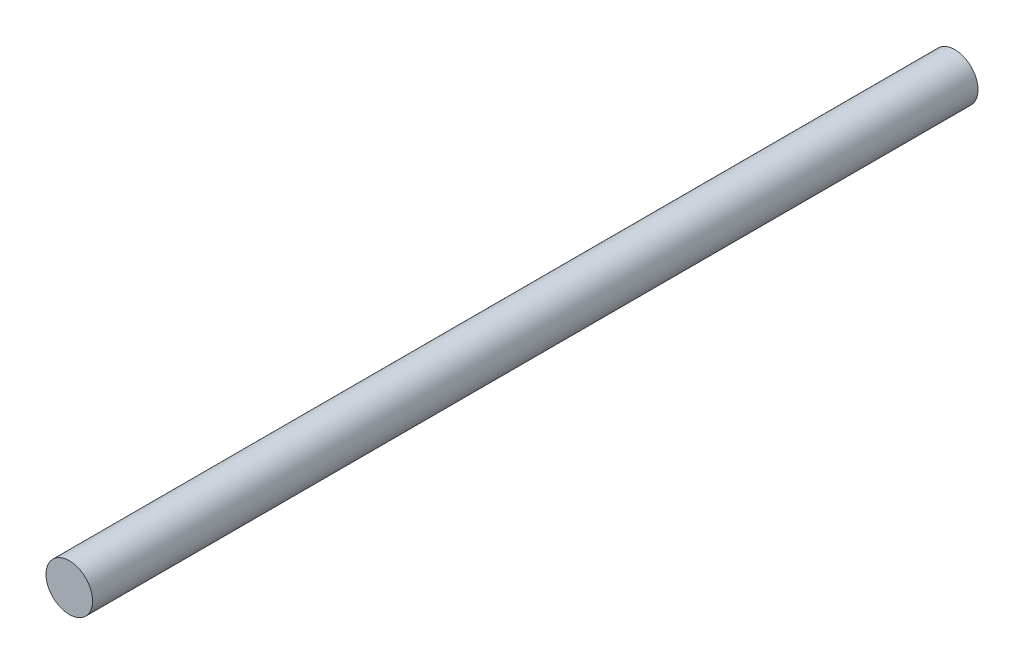
ISO-10303-21;
HEADER;
FILE_DESCRIPTION(('STEP AP214'),'2;1');
FILE_NAME('part.step','',(''),(''),'','','');
FILE_SCHEMA(('AUTOMOTIVE_DESIGN { 1 0 10303 214 1 1 1 1 }'));
ENDSEC;
DATA;
#1=APPLICATION_CONTEXT('core data for automotive mechanical design processes');
#2=APPLICATION_PROTOCOL_DEFINITION('international standard','automotive_design',2000,#1);
#3=PRODUCT_CONTEXT('',#1,'mechanical');
#4=PRODUCT('Part','Part','',(#3));
#5=PRODUCT_RELATED_PRODUCT_CATEGORY('part','',(#4));
#6=PRODUCT_DEFINITION_FORMATION('','',#4);
#7=PRODUCT_DEFINITION_CONTEXT('part definition',#1,'design');
#8=PRODUCT_DEFINITION('design','',#6,#7);
#9=PRODUCT_DEFINITION_SHAPE('','',#8);
#10=(LENGTH_UNIT() NAMED_UNIT(*) SI_UNIT(.MILLI.,.METRE.));
#11=(NAMED_UNIT(*) PLANE_ANGLE_UNIT() SI_UNIT($,.RADIAN.));
#12=(NAMED_UNIT(*) SI_UNIT($,.STERADIAN.) SOLID_ANGLE_UNIT());
#13=UNCERTAINTY_MEASURE_WITH_UNIT(LENGTH_MEASURE(1.E-05),#10,'distance_accuracy_value','');
#14=(GEOMETRIC_REPRESENTATION_CONTEXT(3) GLOBAL_UNCERTAINTY_ASSIGNED_CONTEXT((#13)) GLOBAL_UNIT_ASSIGNED_CONTEXT((#10,
#11,#12)) REPRESENTATION_CONTEXT('',''));
#15=CARTESIAN_POINT('',(0.,0.,0.));
#16=DIRECTION('',(0.,0.,1.));
#17=DIRECTION('',(1.,0.,0.));
#18=AXIS2_PLACEMENT_3D('',#15,#16,#17);
#19=CARTESIAN_POINT('',(0.,0.,241.3));
#20=DIRECTION('',(0.,0.,-1.));
#21=DIRECTION('',(-1.,0.,0.));
#22=AXIS2_PLACEMENT_3D('',#19,#20,#21);
#23=CYLINDRICAL_SURFACE('',#22,6.35);
#24=CARTESIAN_POINT('',(0.,0.,241.3));
#25=DIRECTION('',(0.,0.,1.));
#26=DIRECTION('',(1.,0.,0.));
#27=AXIS2_PLACEMENT_3D('',#24,#25,#26);
#28=CIRCLE('',#27,6.35);
#29=CARTESIAN_POINT('',(-6.35,0.,241.3));
#30=VERTEX_POINT('',#29);
#31=EDGE_CURVE('E10',#30,#30,#28,.T.);
#32=CARTESIAN_POINT('',(0.,0.,0.));
#33=DIRECTION('',(0.,0.,1.));
#34=DIRECTION('',(1.,0.,0.));
#35=AXIS2_PLACEMENT_3D('',#32,#33,#34);
#36=CIRCLE('',#35,6.35);
#37=CARTESIAN_POINT('',(-6.35,0.,0.));
#38=VERTEX_POINT('',#37);
#39=EDGE_CURVE('E38',#38,#38,#36,.T.);
#40=CARTESIAN_POINT('',(-6.35,0.,241.3));
#41=CARTESIAN_POINT('',(-6.35,0.,238.786458333333));
#42=CARTESIAN_POINT('',(-6.35,0.,236.272916666667));
#43=CARTESIAN_POINT('',(-6.35,0.,231.245833333333));
#44=CARTESIAN_POINT('',(-6.35,0.,228.732291666667));
#45=CARTESIAN_POINT('',(-6.35,0.,223.705208333333));
#46=CARTESIAN_POINT('',(-6.35,0.,221.191666666667));
#47=CARTESIAN_POINT('',(-6.35,0.,216.164583333333));
#48=CARTESIAN_POINT('',(-6.35,0.,213.651041666667));
#49=CARTESIAN_POINT('',(-6.35,0.,208.623958333333));
#50=CARTESIAN_POINT('',(-6.35,0.,206.110416666667));
#51=CARTESIAN_POINT('',(-6.35,0.,201.083333333333));
#52=CARTESIAN_POINT('',(-6.35,0.,198.569791666667));
#53=CARTESIAN_POINT('',(-6.35,0.,193.542708333333));
#54=CARTESIAN_POINT('',(-6.35,0.,191.029166666667));
#55=CARTESIAN_POINT('',(-6.35,0.,186.002083333333));
#56=CARTESIAN_POINT('',(-6.35,0.,183.488541666667));
#57=CARTESIAN_POINT('',(-6.35,0.,178.461458333333));
#58=CARTESIAN_POINT('',(-6.35,0.,175.947916666667));
#59=CARTESIAN_POINT('',(-6.35,0.,170.920833333333));
#60=CARTESIAN_POINT('',(-6.35,0.,168.407291666667));
#61=CARTESIAN_POINT('',(-6.35,0.,163.380208333333));
#62=CARTESIAN_POINT('',(-6.35,0.,160.866666666667));
#63=CARTESIAN_POINT('',(-6.35,0.,155.839583333333));
#64=CARTESIAN_POINT('',(-6.35,0.,153.326041666667));
#65=CARTESIAN_POINT('',(-6.35,0.,148.298958333333));
#66=CARTESIAN_POINT('',(-6.35,0.,145.785416666667));
#67=CARTESIAN_POINT('',(-6.35,0.,140.758333333333));
#68=CARTESIAN_POINT('',(-6.35,0.,138.244791666667));
#69=CARTESIAN_POINT('',(-6.35,0.,133.217708333333));
#70=CARTESIAN_POINT('',(-6.35,0.,130.704166666667));
#71=CARTESIAN_POINT('',(-6.35,0.,125.677083333333));
#72=CARTESIAN_POINT('',(-6.35,0.,123.163541666667));
#73=CARTESIAN_POINT('',(-6.35,0.,118.136458333333));
#74=CARTESIAN_POINT('',(-6.35,0.,115.622916666667));
#75=CARTESIAN_POINT('',(-6.35,0.,110.595833333333));
#76=CARTESIAN_POINT('',(-6.35,0.,108.082291666667));
#77=CARTESIAN_POINT('',(-6.35,0.,103.055208333333));
#78=CARTESIAN_POINT('',(-6.35,0.,100.541666666667));
#79=CARTESIAN_POINT('',(-6.35,0.,95.5145833333333));
#80=CARTESIAN_POINT('',(-6.35,0.,93.0010416666667));
#81=CARTESIAN_POINT('',(-6.35,0.,87.9739583333333));
#82=CARTESIAN_POINT('',(-6.35,0.,85.4604166666667));
#83=CARTESIAN_POINT('',(-6.35,0.,80.4333333333333));
#84=CARTESIAN_POINT('',(-6.35,0.,77.9197916666667));
#85=CARTESIAN_POINT('',(-6.35,0.,72.8927083333333));
#86=CARTESIAN_POINT('',(-6.35,0.,70.3791666666667));
#87=CARTESIAN_POINT('',(-6.35,0.,65.3520833333333));
#88=CARTESIAN_POINT('',(-6.35,0.,62.8385416666667));
#89=CARTESIAN_POINT('',(-6.35,0.,57.8114583333333));
#90=CARTESIAN_POINT('',(-6.35,0.,55.2979166666667));
#91=CARTESIAN_POINT('',(-6.35,0.,50.2708333333333));
#92=CARTESIAN_POINT('',(-6.35,0.,47.7572916666667));
#93=CARTESIAN_POINT('',(-6.35,0.,42.7302083333333));
#94=CARTESIAN_POINT('',(-6.35,0.,40.2166666666667));
#95=CARTESIAN_POINT('',(-6.35,0.,35.1895833333333));
#96=CARTESIAN_POINT('',(-6.35,0.,32.6760416666667));
#97=CARTESIAN_POINT('',(-6.35,0.,27.6489583333333));
#98=CARTESIAN_POINT('',(-6.35,0.,25.1354166666667));
#99=CARTESIAN_POINT('',(-6.35,0.,20.1083333333333));
#100=CARTESIAN_POINT('',(-6.35,0.,17.5947916666667));
#101=CARTESIAN_POINT('',(-6.35,0.,12.5677083333333));
#102=CARTESIAN_POINT('',(-6.35,0.,10.0541666666667));
#103=CARTESIAN_POINT('',(-6.35,0.,5.02708333333333));
#104=CARTESIAN_POINT('',(-6.35,0.,2.51354166666667));
#105=CARTESIAN_POINT('',(-6.35,0.,0.));
#106=B_SPLINE_CURVE_WITH_KNOTS('',3,(#40,#41,#42,#43,#44,#45,#46,#47,#48,#49,#50,#51,#52,#53,
#54,#55,#56,#57,#58,#59,#60,#61,#62,#63,#64,#65,#66,#67,#68,#69,#70,#71,#72,#73,#74,#75,#76,#77,
#78,#79,#80,#81,#82,#83,#84,#85,#86,#87,#88,#89,#90,#91,#92,#93,#94,#95,#96,#97,#98,#99,#100,
#101,#102,#103,#104,#105),.UNSPECIFIED.,.F.,.F.,(4,2,2,2,2,2,2,2,2,2,2,2,2,2,2,2,2,2,2,2,2,2,2,
2,2,2,2,2,2,2,2,2,4),(0.,7.540625,15.08125,22.621875,30.1625,37.703125,45.24375,52.784375,
60.325,67.865625,75.40625,82.946875,90.4875,98.028125,105.56875,113.109375,120.65,128.190625,
135.73125,143.271875,150.8125,158.353125,165.89375,173.434375,180.975,188.515625,196.05625,
203.596875,211.1375,218.678125,226.21875,233.759375,241.3),.UNSPECIFIED.);
#107=EDGE_CURVE('BSEAM35',#30,#38,#106,.T.);
#108=ORIENTED_EDGE('',*,*,#31,.F.);
#109=ORIENTED_EDGE('',*,*,#39,.T.);
#110=ORIENTED_EDGE('',*,*,#107,.T.);
#111=ORIENTED_EDGE('',*,*,#107,.F.);
#112=EDGE_LOOP('',(#108,#110,#109,#111));
#113=FACE_BOUND('',#112,.T.);
#114=ADVANCED_FACE('F35',(#113),#23,.T.);
#115=CARTESIAN_POINT('',(0.,0.,241.3));
#116=DIRECTION('',(0.,0.,1.));
#117=DIRECTION('',(1.,0.,0.));
#118=AXIS2_PLACEMENT_3D('',#115,#116,#117);
#119=PLANE('',#118);
#120=ORIENTED_EDGE('',*,*,#31,.T.);
#121=EDGE_LOOP('',(#120));
#122=FACE_BOUND('',#121,.T.);
#123=ADVANCED_FACE('F50',(#122),#119,.T.);
#124=CARTESIAN_POINT('',(0.,0.,0.));
#125=DIRECTION('',(0.,0.,1.));
#126=DIRECTION('',(1.,0.,0.));
#127=AXIS2_PLACEMENT_3D('',#124,#125,#126);
#128=PLANE('',#127);
#129=ORIENTED_EDGE('',*,*,#39,.F.);
#130=EDGE_LOOP('',(#129));
#131=FACE_BOUND('',#130,.T.);
#132=ADVANCED_FACE('F48',(#131),#128,.F.);
#133=CLOSED_SHELL('',(#114,#123,#132));
#134=MANIFOLD_SOLID_BREP('B2',#133);
#135=ADVANCED_BREP_SHAPE_REPRESENTATION('',(#18,#134),#14);
#136=SHAPE_DEFINITION_REPRESENTATION(#9,#135);
ENDSEC;
END-ISO-10303-21;
